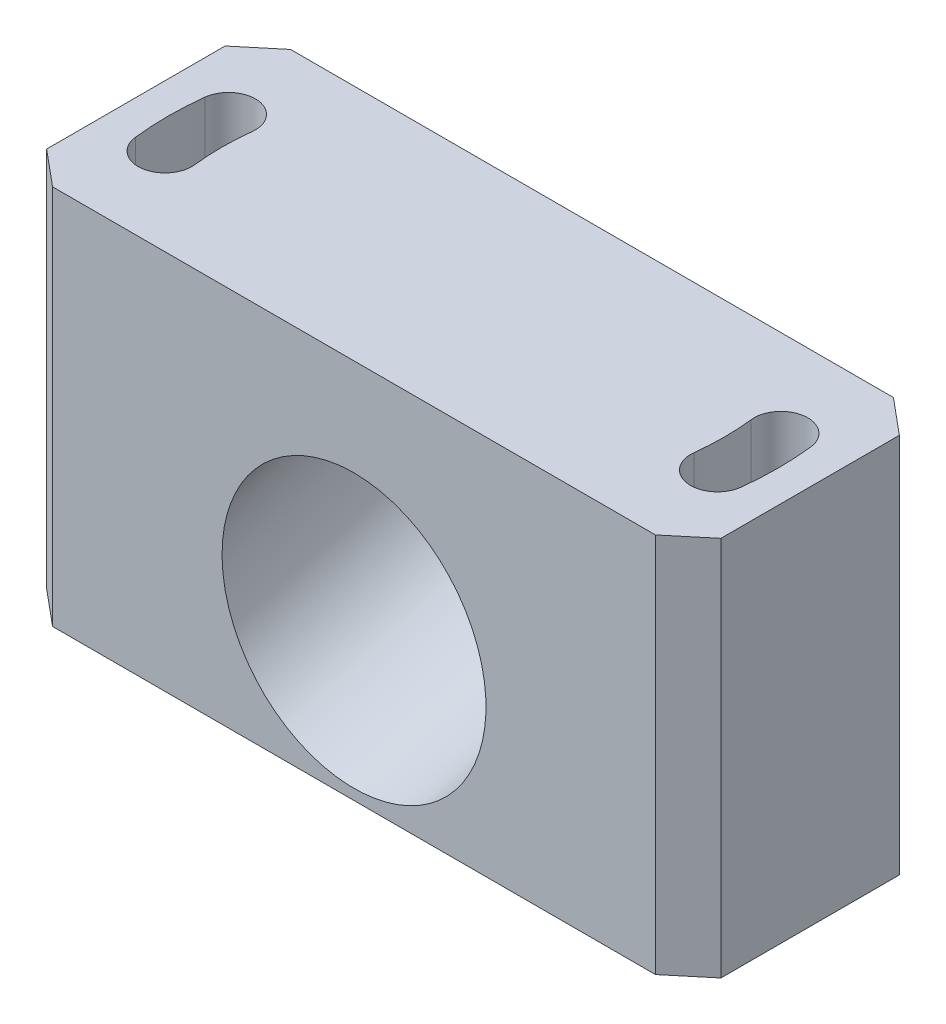
ISO-10303-21;
HEADER;
FILE_DESCRIPTION(('STEP AP214'),'2;1');
FILE_NAME('part.step','',(''),(''),'','','');
FILE_SCHEMA(('AUTOMOTIVE_DESIGN { 1 0 10303 214 1 1 1 1 }'));
ENDSEC;
DATA;
#1=APPLICATION_CONTEXT('core data for automotive mechanical design processes');
#2=APPLICATION_PROTOCOL_DEFINITION('international standard','automotive_design',2000,#1);
#3=PRODUCT_CONTEXT('',#1,'mechanical');
#4=PRODUCT('Part','Part','',(#3));
#5=PRODUCT_RELATED_PRODUCT_CATEGORY('part','',(#4));
#6=PRODUCT_DEFINITION_FORMATION('','',#4);
#7=PRODUCT_DEFINITION_CONTEXT('part definition',#1,'design');
#8=PRODUCT_DEFINITION('design','',#6,#7);
#9=PRODUCT_DEFINITION_SHAPE('','',#8);
#10=(LENGTH_UNIT() NAMED_UNIT(*) SI_UNIT(.MILLI.,.METRE.));
#11=(NAMED_UNIT(*) PLANE_ANGLE_UNIT() SI_UNIT($,.RADIAN.));
#12=(NAMED_UNIT(*) SI_UNIT($,.STERADIAN.) SOLID_ANGLE_UNIT());
#13=UNCERTAINTY_MEASURE_WITH_UNIT(LENGTH_MEASURE(1.E-05),#10,'distance_accuracy_value','');
#14=(GEOMETRIC_REPRESENTATION_CONTEXT(3) GLOBAL_UNCERTAINTY_ASSIGNED_CONTEXT((#13)) GLOBAL_UNIT_ASSIGNED_CONTEXT((#10,
#11,#12)) REPRESENTATION_CONTEXT('',''));
#15=CARTESIAN_POINT('',(0.,0.,0.));
#16=DIRECTION('',(0.,0.,1.));
#17=DIRECTION('',(1.,0.,0.));
#18=AXIS2_PLACEMENT_3D('',#15,#16,#17);
#19=CARTESIAN_POINT('',(0.,0.,15.));
#20=DIRECTION('',(0.,0.,-1.));
#21=DIRECTION('',(-1.,0.,0.));
#22=AXIS2_PLACEMENT_3D('',#19,#20,#21);
#23=PLANE('',#22);
#24=CARTESIAN_POINT('',(0.,-1.94868552564668,15.));
#25=DIRECTION('',(0.,0.,-1.));
#26=DIRECTION('',(0.,1.,0.));
#27=AXIS2_PLACEMENT_3D('',#24,#25,#26);
#28=ELLIPSE('',#27,17.2238898134826,16.637);
#29=CARTESIAN_POINT('',(0.,15.2752042878359,15.));
#30=VERTEX_POINT('',#29);
#31=EDGE_CURVE('E214',#30,#30,#28,.T.);
#32=ORIENTED_EDGE('',*,*,#31,.T.);
#33=EDGE_LOOP('',(#32));
#34=FACE_BOUND('',#33,.T.);
#35=DIRECTION('',(-1.,0.,0.));
#36=VECTOR('',#35,1.);
#37=CARTESIAN_POINT('',(0.,-20.5,15.));
#38=LINE('',#37,#36);
#39=CARTESIAN_POINT('',(38.,-20.5,15.));
#40=VERTEX_POINT('',#39);
#41=CARTESIAN_POINT('',(-38.,-20.5,15.));
#42=VERTEX_POINT('',#41);
#43=EDGE_CURVE('E327',#40,#42,#38,.T.);
#44=ORIENTED_EDGE('',*,*,#43,.F.);
#45=DIRECTION('',(0.,1.,0.));
#46=VECTOR('',#45,1.);
#47=CARTESIAN_POINT('',(38.,-27.5,15.));
#48=LINE('',#47,#46);
#49=CARTESIAN_POINT('',(38.,27.5,15.));
#50=VERTEX_POINT('',#49);
#51=EDGE_CURVE('E166',#40,#50,#48,.T.);
#52=ORIENTED_EDGE('',*,*,#51,.T.);
#53=DIRECTION('',(-1.,0.,0.));
#54=VECTOR('',#53,1.);
#55=CARTESIAN_POINT('',(-50.,27.5,15.));
#56=LINE('',#55,#54);
#57=CARTESIAN_POINT('',(-38.,27.5,15.));
#58=VERTEX_POINT('',#57);
#59=EDGE_CURVE('E48',#50,#58,#56,.T.);
#60=ORIENTED_EDGE('',*,*,#59,.T.);
#61=DIRECTION('',(0.,1.,0.));
#62=VECTOR('',#61,1.);
#63=CARTESIAN_POINT('',(-38.,-27.5,15.));
#64=LINE('',#63,#62);
#65=EDGE_CURVE('E193',#42,#58,#64,.T.);
#66=ORIENTED_EDGE('',*,*,#65,.F.);
#67=EDGE_LOOP('',(#44,#52,#60,#66));
#68=FACE_BOUND('',#67,.T.);
#69=ADVANCED_FACE('F39',(#34,#68),#23,.F.);
#70=CARTESIAN_POINT('',(0.,0.,-15.));
#71=DIRECTION('',(0.,0.,-1.));
#72=DIRECTION('',(-1.,0.,0.));
#73=AXIS2_PLACEMENT_3D('',#70,#71,#72);
#74=PLANE('',#73);
#75=CARTESIAN_POINT('',(0.,6.08979024728702,-15.));
#76=DIRECTION('',(0.,0.,-1.));
#77=DIRECTION('',(0.,1.,0.));
#78=AXIS2_PLACEMENT_3D('',#75,#76,#77);
#79=ELLIPSE('',#78,17.2238898134826,16.637);
#80=CARTESIAN_POINT('',(0.,23.3136800607696,-15.));
#81=VERTEX_POINT('',#80);
#82=EDGE_CURVE('E213',#81,#81,#79,.T.);
#83=ORIENTED_EDGE('',*,*,#82,.F.);
#84=EDGE_LOOP('',(#83));
#85=FACE_BOUND('',#84,.T.);
#86=DIRECTION('',(0.,1.,0.));
#87=VECTOR('',#86,1.);
#88=CARTESIAN_POINT('',(38.,-27.5,-15.));
#89=LINE('',#88,#87);
#90=CARTESIAN_POINT('',(38.,-20.5,-15.));
#91=VERTEX_POINT('',#90);
#92=CARTESIAN_POINT('',(38.,27.5,-15.));
#93=VERTEX_POINT('',#92);
#94=EDGE_CURVE('E210',#91,#93,#89,.T.);
#95=ORIENTED_EDGE('',*,*,#94,.F.);
#96=DIRECTION('',(-1.,0.,0.));
#97=VECTOR('',#96,1.);
#98=CARTESIAN_POINT('',(0.,-20.5,-15.));
#99=LINE('',#98,#97);
#100=CARTESIAN_POINT('',(-38.,-20.5,-15.));
#101=VERTEX_POINT('',#100);
#102=EDGE_CURVE('E294',#91,#101,#99,.T.);
#103=ORIENTED_EDGE('',*,*,#102,.T.);
#104=DIRECTION('',(0.,1.,0.));
#105=VECTOR('',#104,1.);
#106=CARTESIAN_POINT('',(-38.,-27.5,-15.));
#107=LINE('',#106,#105);
#108=CARTESIAN_POINT('',(-38.,27.5,-15.));
#109=VERTEX_POINT('',#108);
#110=EDGE_CURVE('E200',#101,#109,#107,.T.);
#111=ORIENTED_EDGE('',*,*,#110,.T.);
#112=DIRECTION('',(-1.,0.,0.));
#113=VECTOR('',#112,1.);
#114=CARTESIAN_POINT('',(-50.,27.5,-15.));
#115=LINE('',#114,#113);
#116=EDGE_CURVE('E240',#93,#109,#115,.T.);
#117=ORIENTED_EDGE('',*,*,#116,.F.);
#118=EDGE_LOOP('',(#95,#103,#111,#117));
#119=FACE_BOUND('',#118,.T.);
#120=ADVANCED_FACE('F287',(#85,#119),#74,.T.);
#121=CARTESIAN_POINT('',(34.8210065908497,-27.5,4.));
#122=DIRECTION('',(0.,1.,0.));
#123=DIRECTION('',(0.,0.,1.));
#124=AXIS2_PLACEMENT_3D('',#121,#122,#123);
#125=CYLINDRICAL_SURFACE('',#124,3.39);
#126=CARTESIAN_POINT('',(34.8210065908497,-20.5,4.));
#127=DIRECTION('',(0.,-1.,0.));
#128=DIRECTION('',(0.,0.,-1.));
#129=AXIS2_PLACEMENT_3D('',#126,#127,#128);
#130=CIRCLE('',#129,3.39);
#131=CARTESIAN_POINT('',(31.4531545981827,-20.5,3.61312410841655));
#132=VERTEX_POINT('',#131);
#133=CARTESIAN_POINT('',(38.1888585835168,-20.5,4.38687589158345));
#134=VERTEX_POINT('',#133);
#135=EDGE_CURVE('E55',#132,#134,#130,.F.);
#136=ORIENTED_EDGE('',*,*,#135,.F.);
#137=DIRECTION('',(0.,1.,0.));
#138=VECTOR('',#137,1.);
#139=CARTESIAN_POINT('',(31.4531545981827,-27.5,3.61312410841655));
#140=LINE('',#139,#138);
#141=CARTESIAN_POINT('',(31.4531545981827,27.5,3.61312410841655));
#142=VERTEX_POINT('',#141);
#143=EDGE_CURVE('E224',#132,#142,#140,.T.);
#144=ORIENTED_EDGE('',*,*,#143,.T.);
#145=CARTESIAN_POINT('',(34.8210065908497,27.5,4.));
#146=DIRECTION('',(0.,1.,0.));
#147=DIRECTION('',(0.,0.,1.));
#148=AXIS2_PLACEMENT_3D('',#145,#146,#147);
#149=CIRCLE('',#148,3.39);
#150=CARTESIAN_POINT('',(38.1888585835168,27.5,4.38687589158345));
#151=VERTEX_POINT('',#150);
#152=EDGE_CURVE('E218',#142,#151,#149,.T.);
#153=ORIENTED_EDGE('',*,*,#152,.T.);
#154=DIRECTION('',(0.,1.,0.));
#155=VECTOR('',#154,1.);
#156=CARTESIAN_POINT('',(38.1888585835168,-27.5,4.38687589158345));
#157=LINE('',#156,#155);
#158=EDGE_CURVE('E264',#134,#151,#157,.T.);
#159=ORIENTED_EDGE('',*,*,#158,.F.);
#160=EDGE_LOOP('',(#136,#144,#153,#159));
#161=FACE_BOUND('',#160,.T.);
#162=ADVANCED_FACE('F290',(#161),#125,.F.);
#163=CARTESIAN_POINT('',(-4.9960036108132E-13,-27.5,0.));
#164=DIRECTION('',(0.,1.,0.));
#165=DIRECTION('',(0.,0.,1.));
#166=AXIS2_PLACEMENT_3D('',#163,#164,#165);
#167=CYLINDRICAL_SURFACE('',#166,31.6600000000005);
#168=CARTESIAN_POINT('',(-4.9960036108132E-13,-20.5,0.));
#169=DIRECTION('',(0.,-1.,0.));
#170=DIRECTION('',(0.,0.,-1.));
#171=AXIS2_PLACEMENT_3D('',#168,#169,#170);
#172=CIRCLE('',#171,31.6600000000005);
#173=CARTESIAN_POINT('',(31.4531545981827,-20.5,-3.61312410841655));
#174=VERTEX_POINT('',#173);
#175=EDGE_CURVE('E304',#174,#132,#172,.T.);
#176=ORIENTED_EDGE('',*,*,#175,.F.);
#177=DIRECTION('',(0.,1.,0.));
#178=VECTOR('',#177,1.);
#179=CARTESIAN_POINT('',(31.4531545981827,-27.5,-3.61312410841655));
#180=LINE('',#179,#178);
#181=CARTESIAN_POINT('',(31.4531545981827,27.5,-3.61312410841655));
#182=VERTEX_POINT('',#181);
#183=EDGE_CURVE('E267',#174,#182,#180,.T.);
#184=ORIENTED_EDGE('',*,*,#183,.T.);
#185=CARTESIAN_POINT('',(-4.9960036108132E-13,27.5,0.));
#186=DIRECTION('',(0.,-1.,0.));
#187=DIRECTION('',(0.,0.,1.));
#188=AXIS2_PLACEMENT_3D('',#185,#186,#187);
#189=CIRCLE('',#188,31.6600000000005);
#190=EDGE_CURVE('E260',#182,#142,#189,.T.);
#191=ORIENTED_EDGE('',*,*,#190,.T.);
#192=ORIENTED_EDGE('',*,*,#143,.F.);
#193=EDGE_LOOP('',(#176,#184,#191,#192));
#194=FACE_BOUND('',#193,.T.);
#195=ADVANCED_FACE('F362',(#194),#167,.T.);
#196=CARTESIAN_POINT('',(34.8210065908497,-27.5,-4.));
#197=DIRECTION('',(0.,1.,0.));
#198=DIRECTION('',(0.,0.,1.));
#199=AXIS2_PLACEMENT_3D('',#196,#197,#198);
#200=CYLINDRICAL_SURFACE('',#199,3.39);
#201=CARTESIAN_POINT('',(34.8210065908497,-20.5,-4.));
#202=DIRECTION('',(0.,-1.,0.));
#203=DIRECTION('',(0.,0.,-1.));
#204=AXIS2_PLACEMENT_3D('',#201,#202,#203);
#205=CIRCLE('',#204,3.39);
#206=CARTESIAN_POINT('',(38.1888585835168,-20.5,-4.38687589158345));
#207=VERTEX_POINT('',#206);
#208=EDGE_CURVE('E307',#207,#174,#205,.F.);
#209=ORIENTED_EDGE('',*,*,#208,.F.);
#210=DIRECTION('',(0.,1.,0.));
#211=VECTOR('',#210,1.);
#212=CARTESIAN_POINT('',(38.1888585835168,-27.5,-4.38687589158345));
#213=LINE('',#212,#211);
#214=CARTESIAN_POINT('',(38.1888585835168,27.5,-4.38687589158345));
#215=VERTEX_POINT('',#214);
#216=EDGE_CURVE('E270',#207,#215,#213,.T.);
#217=ORIENTED_EDGE('',*,*,#216,.T.);
#218=CARTESIAN_POINT('',(34.8210065908497,27.5,-4.));
#219=DIRECTION('',(0.,1.,0.));
#220=DIRECTION('',(0.,0.,1.));
#221=AXIS2_PLACEMENT_3D('',#218,#219,#220);
#222=CIRCLE('',#221,3.39);
#223=EDGE_CURVE('E256',#215,#182,#222,.T.);
#224=ORIENTED_EDGE('',*,*,#223,.T.);
#225=ORIENTED_EDGE('',*,*,#183,.F.);
#226=EDGE_LOOP('',(#209,#217,#224,#225));
#227=FACE_BOUND('',#226,.T.);
#228=ADVANCED_FACE('F363',(#227),#200,.F.);
#229=CARTESIAN_POINT('',(-4.9960036108132E-13,-27.5,0.));
#230=DIRECTION('',(0.,1.,0.));
#231=DIRECTION('',(0.,0.,1.));
#232=AXIS2_PLACEMENT_3D('',#229,#230,#231);
#233=CYLINDRICAL_SURFACE('',#232,38.4400000000005);
#234=CARTESIAN_POINT('',(-4.9960036108132E-13,-20.5,0.));
#235=DIRECTION('',(0.,-1.,0.));
#236=DIRECTION('',(0.,0.,-1.));
#237=AXIS2_PLACEMENT_3D('',#234,#235,#236);
#238=CIRCLE('',#237,38.4400000000005);
#239=EDGE_CURVE('E352',#134,#207,#238,.F.);
#240=ORIENTED_EDGE('',*,*,#239,.F.);
#241=ORIENTED_EDGE('',*,*,#158,.T.);
#242=CARTESIAN_POINT('',(-4.9960036108132E-13,27.5,0.));
#243=DIRECTION('',(0.,1.,0.));
#244=DIRECTION('',(0.,0.,1.));
#245=AXIS2_PLACEMENT_3D('',#242,#243,#244);
#246=CIRCLE('',#245,38.4400000000005);
#247=EDGE_CURVE('E252',#151,#215,#246,.T.);
#248=ORIENTED_EDGE('',*,*,#247,.T.);
#249=ORIENTED_EDGE('',*,*,#216,.F.);
#250=EDGE_LOOP('',(#240,#241,#248,#249));
#251=FACE_BOUND('',#250,.T.);
#252=ADVANCED_FACE('F372',(#251),#233,.F.);
#253=CARTESIAN_POINT('',(-34.8210065908497,-27.5,-4.));
#254=DIRECTION('',(0.,1.,0.));
#255=DIRECTION('',(0.,0.,1.));
#256=AXIS2_PLACEMENT_3D('',#253,#254,#255);
#257=CYLINDRICAL_SURFACE('',#256,3.39000000000001);
#258=CARTESIAN_POINT('',(-34.8210065908497,-20.5,-4.));
#259=DIRECTION('',(0.,-1.,0.));
#260=DIRECTION('',(0.,0.,-1.));
#261=AXIS2_PLACEMENT_3D('',#258,#259,#260);
#262=CIRCLE('',#261,3.39000000000001);
#263=CARTESIAN_POINT('',(-31.4531545981827,-20.5,-3.61312410841657));
#264=VERTEX_POINT('',#263);
#265=CARTESIAN_POINT('',(-38.1888585835169,-20.5,-4.38687589158348));
#266=VERTEX_POINT('',#265);
#267=EDGE_CURVE('E63',#264,#266,#262,.F.);
#268=ORIENTED_EDGE('',*,*,#267,.F.);
#269=DIRECTION('',(0.,1.,0.));
#270=VECTOR('',#269,1.);
#271=CARTESIAN_POINT('',(-31.4531545981827,-27.5,-3.61312410841657));
#272=LINE('',#271,#270);
#273=CARTESIAN_POINT('',(-31.4531545981827,27.5,-3.61312410841657));
#274=VERTEX_POINT('',#273);
#275=EDGE_CURVE('E237',#264,#274,#272,.T.);
#276=ORIENTED_EDGE('',*,*,#275,.T.);
#277=CARTESIAN_POINT('',(-34.8210065908497,27.5,-4.));
#278=DIRECTION('',(0.,1.,0.));
#279=DIRECTION('',(0.,0.,1.));
#280=AXIS2_PLACEMENT_3D('',#277,#278,#279);
#281=CIRCLE('',#280,3.39000000000001);
#282=CARTESIAN_POINT('',(-38.1888585835169,27.5,-4.38687589158348));
#283=VERTEX_POINT('',#282);
#284=EDGE_CURVE('E219',#274,#283,#281,.T.);
#285=ORIENTED_EDGE('',*,*,#284,.T.);
#286=DIRECTION('',(0.,1.,0.));
#287=VECTOR('',#286,1.);
#288=CARTESIAN_POINT('',(-38.1888585835169,-27.5,-4.38687589158348));
#289=LINE('',#288,#287);
#290=EDGE_CURVE('E236',#266,#283,#289,.T.);
#291=ORIENTED_EDGE('',*,*,#290,.F.);
#292=EDGE_LOOP('',(#268,#276,#285,#291));
#293=FACE_BOUND('',#292,.T.);
#294=ADVANCED_FACE('F374',(#293),#257,.F.);
#295=CARTESIAN_POINT('',(0.,-27.5,0.));
#296=DIRECTION('',(0.,1.,0.));
#297=DIRECTION('',(0.,0.,1.));
#298=AXIS2_PLACEMENT_3D('',#295,#296,#297);
#299=CYLINDRICAL_SURFACE('',#298,31.6600000000002);
#300=CARTESIAN_POINT('',(0.,-20.5,0.));
#301=DIRECTION('',(0.,-1.,0.));
#302=DIRECTION('',(0.,0.,-1.));
#303=AXIS2_PLACEMENT_3D('',#300,#301,#302);
#304=CIRCLE('',#303,31.6600000000002);
#305=CARTESIAN_POINT('',(-31.4531545981826,-20.5,3.61312410841655));
#306=VERTEX_POINT('',#305);
#307=EDGE_CURVE('E347',#306,#264,#304,.T.);
#308=ORIENTED_EDGE('',*,*,#307,.F.);
#309=DIRECTION('',(0.,1.,0.));
#310=VECTOR('',#309,1.);
#311=CARTESIAN_POINT('',(-31.4531545981826,-27.5,3.61312410841655));
#312=LINE('',#311,#310);
#313=CARTESIAN_POINT('',(-31.4531545981826,27.5,3.61312410841655));
#314=VERTEX_POINT('',#313);
#315=EDGE_CURVE('E241',#306,#314,#312,.T.);
#316=ORIENTED_EDGE('',*,*,#315,.T.);
#317=CARTESIAN_POINT('',(0.,27.5,0.));
#318=DIRECTION('',(0.,-1.,0.));
#319=DIRECTION('',(0.,0.,1.));
#320=AXIS2_PLACEMENT_3D('',#317,#318,#319);
#321=CIRCLE('',#320,31.6600000000002);
#322=EDGE_CURVE('E232',#314,#274,#321,.T.);
#323=ORIENTED_EDGE('',*,*,#322,.T.);
#324=ORIENTED_EDGE('',*,*,#275,.F.);
#325=EDGE_LOOP('',(#308,#316,#323,#324));
#326=FACE_BOUND('',#325,.T.);
#327=ADVANCED_FACE('F380',(#326),#299,.T.);
#328=CARTESIAN_POINT('',(-34.8210065908497,-27.5,4.));
#329=DIRECTION('',(0.,1.,0.));
#330=DIRECTION('',(0.,0.,1.));
#331=AXIS2_PLACEMENT_3D('',#328,#329,#330);
#332=CYLINDRICAL_SURFACE('',#331,3.39000000000001);
#333=CARTESIAN_POINT('',(-34.8210065908497,-20.5,4.));
#334=DIRECTION('',(0.,-1.,0.));
#335=DIRECTION('',(0.,0.,-1.));
#336=AXIS2_PLACEMENT_3D('',#333,#334,#335);
#337=CIRCLE('',#336,3.39000000000001);
#338=CARTESIAN_POINT('',(-38.1888585835169,-20.5,4.38687589158347));
#339=VERTEX_POINT('',#338);
#340=EDGE_CURVE('E344',#339,#306,#337,.F.);
#341=ORIENTED_EDGE('',*,*,#340,.F.);
#342=DIRECTION('',(0.,1.,0.));
#343=VECTOR('',#342,1.);
#344=CARTESIAN_POINT('',(-38.1888585835169,-27.5,4.38687589158347));
#345=LINE('',#344,#343);
#346=CARTESIAN_POINT('',(-38.1888585835169,27.5,4.38687589158347));
#347=VERTEX_POINT('',#346);
#348=EDGE_CURVE('E244',#339,#347,#345,.T.);
#349=ORIENTED_EDGE('',*,*,#348,.T.);
#350=CARTESIAN_POINT('',(-34.8210065908497,27.5,4.));
#351=DIRECTION('',(0.,1.,0.));
#352=DIRECTION('',(0.,0.,1.));
#353=AXIS2_PLACEMENT_3D('',#350,#351,#352);
#354=CIRCLE('',#353,3.39000000000001);
#355=EDGE_CURVE('E228',#347,#314,#354,.T.);
#356=ORIENTED_EDGE('',*,*,#355,.T.);
#357=ORIENTED_EDGE('',*,*,#315,.F.);
#358=EDGE_LOOP('',(#341,#349,#356,#357));
#359=FACE_BOUND('',#358,.T.);
#360=ADVANCED_FACE('F401',(#359),#332,.F.);
#361=CARTESIAN_POINT('',(0.,-27.5,0.));
#362=DIRECTION('',(0.,1.,0.));
#363=DIRECTION('',(0.,0.,1.));
#364=AXIS2_PLACEMENT_3D('',#361,#362,#363);
#365=CYLINDRICAL_SURFACE('',#364,38.4400000000002);
#366=CARTESIAN_POINT('',(0.,-20.5,0.));
#367=DIRECTION('',(0.,-1.,0.));
#368=DIRECTION('',(0.,0.,-1.));
#369=AXIS2_PLACEMENT_3D('',#366,#367,#368);
#370=CIRCLE('',#369,38.4400000000002);
#371=EDGE_CURVE('E341',#266,#339,#370,.F.);
#372=ORIENTED_EDGE('',*,*,#371,.F.);
#373=ORIENTED_EDGE('',*,*,#290,.T.);
#374=CARTESIAN_POINT('',(0.,27.5,0.));
#375=DIRECTION('',(0.,1.,0.));
#376=DIRECTION('',(0.,0.,1.));
#377=AXIS2_PLACEMENT_3D('',#374,#375,#376);
#378=CIRCLE('',#377,38.4400000000002);
#379=EDGE_CURVE('E223',#283,#347,#378,.T.);
#380=ORIENTED_EDGE('',*,*,#379,.T.);
#381=ORIENTED_EDGE('',*,*,#348,.F.);
#382=EDGE_LOOP('',(#372,#373,#380,#381));
#383=FACE_BOUND('',#382,.T.);
#384=ADVANCED_FACE('F398',(#383),#365,.F.);
#385=CARTESIAN_POINT('',(22.9508196721312,-27.5,-27.5409836065574));
#386=DIRECTION('',(0.64018439966448,0.,-0.768221279597376));
#387=DIRECTION('',(-0.768221279597376,0.,-0.64018439966448));
#388=AXIS2_PLACEMENT_3D('',#385,#386,#387);
#389=PLANE('',#388);
#390=DIRECTION('',(0.,1.,0.));
#391=VECTOR('',#390,1.);
#392=CARTESIAN_POINT('',(42.5,-27.5,-11.25));
#393=LINE('',#392,#391);
#394=CARTESIAN_POINT('',(42.5,-20.5,-11.25));
#395=VERTEX_POINT('',#394);
#396=CARTESIAN_POINT('',(42.5,27.5,-11.25));
#397=VERTEX_POINT('',#396);
#398=EDGE_CURVE('E175',#395,#397,#393,.T.);
#399=ORIENTED_EDGE('',*,*,#398,.F.);
#400=DIRECTION('',(-0.768221279597376,0.,-0.64018439966448));
#401=VECTOR('',#400,1.);
#402=CARTESIAN_POINT('',(22.9508196721312,-20.5,-27.5409836065574));
#403=LINE('',#402,#401);
#404=EDGE_CURVE('E156',#395,#91,#403,.T.);
#405=ORIENTED_EDGE('',*,*,#404,.T.);
#406=ORIENTED_EDGE('',*,*,#94,.T.);
#407=DIRECTION('',(-0.768221279597376,0.,-0.64018439966448));
#408=VECTOR('',#407,1.);
#409=CARTESIAN_POINT('',(22.9508196721312,27.5,-27.5409836065574));
#410=LINE('',#409,#408);
#411=EDGE_CURVE('E192',#397,#93,#410,.T.);
#412=ORIENTED_EDGE('',*,*,#411,.F.);
#413=EDGE_LOOP('',(#399,#405,#406,#412));
#414=FACE_BOUND('',#413,.T.);
#415=ADVANCED_FACE('F298',(#414),#389,.T.);
#416=CARTESIAN_POINT('',(-50.,-27.5,-5.));
#417=DIRECTION('',(0.64018439966448,0.,0.768221279597376));
#418=DIRECTION('',(0.768221279597376,0.,-0.64018439966448));
#419=AXIS2_PLACEMENT_3D('',#416,#417,#418);
#420=PLANE('',#419);
#421=DIRECTION('',(0.768221279597376,0.,-0.64018439966448));
#422=VECTOR('',#421,1.);
#423=CARTESIAN_POINT('',(-50.,-20.5,-5.));
#424=LINE('',#423,#422);
#425=CARTESIAN_POINT('',(-42.5,-20.5,-11.25));
#426=VERTEX_POINT('',#425);
#427=EDGE_CURVE('E332',#426,#101,#424,.T.);
#428=ORIENTED_EDGE('',*,*,#427,.F.);
#429=DIRECTION('',(0.,1.,0.));
#430=VECTOR('',#429,1.);
#431=CARTESIAN_POINT('',(-42.5,-27.5,-11.25));
#432=LINE('',#431,#430);
#433=CARTESIAN_POINT('',(-42.5,27.5,-11.25));
#434=VERTEX_POINT('',#433);
#435=EDGE_CURVE('E203',#426,#434,#432,.T.);
#436=ORIENTED_EDGE('',*,*,#435,.T.);
#437=DIRECTION('',(0.768221279597376,0.,-0.64018439966448));
#438=VECTOR('',#437,1.);
#439=CARTESIAN_POINT('',(-50.,27.5,-5.));
#440=LINE('',#439,#438);
#441=EDGE_CURVE('E196',#434,#109,#440,.T.);
#442=ORIENTED_EDGE('',*,*,#441,.T.);
#443=ORIENTED_EDGE('',*,*,#110,.F.);
#444=EDGE_LOOP('',(#428,#436,#442,#443));
#445=FACE_BOUND('',#444,.T.);
#446=ADVANCED_FACE('F413',(#445),#420,.F.);
#447=CARTESIAN_POINT('',(22.9508196721312,-27.5,27.5409836065574));
#448=DIRECTION('',(0.64018439966448,0.,0.768221279597376));
#449=DIRECTION('',(0.768221279597376,0.,-0.64018439966448));
#450=AXIS2_PLACEMENT_3D('',#447,#448,#449);
#451=PLANE('',#450);
#452=ORIENTED_EDGE('',*,*,#51,.F.);
#453=DIRECTION('',(0.768221279597376,0.,-0.64018439966448));
#454=VECTOR('',#453,1.);
#455=CARTESIAN_POINT('',(22.9508196721312,-20.5,27.5409836065574));
#456=LINE('',#455,#454);
#457=CARTESIAN_POINT('',(42.5,-20.5,11.25));
#458=VERTEX_POINT('',#457);
#459=EDGE_CURVE('E153',#40,#458,#456,.T.);
#460=ORIENTED_EDGE('',*,*,#459,.T.);
#461=DIRECTION('',(0.,1.,0.));
#462=VECTOR('',#461,1.);
#463=CARTESIAN_POINT('',(42.5,-27.5,11.25));
#464=LINE('',#463,#462);
#465=CARTESIAN_POINT('',(42.5,27.5,11.25));
#466=VERTEX_POINT('',#465);
#467=EDGE_CURVE('E164',#458,#466,#464,.T.);
#468=ORIENTED_EDGE('',*,*,#467,.T.);
#469=DIRECTION('',(0.768221279597376,0.,-0.64018439966448));
#470=VECTOR('',#469,1.);
#471=CARTESIAN_POINT('',(22.9508196721312,27.5,27.5409836065574));
#472=LINE('',#471,#470);
#473=EDGE_CURVE('E188',#50,#466,#472,.T.);
#474=ORIENTED_EDGE('',*,*,#473,.F.);
#475=EDGE_LOOP('',(#452,#460,#468,#474));
#476=FACE_BOUND('',#475,.T.);
#477=ADVANCED_FACE('F162',(#476),#451,.T.);
#478=CARTESIAN_POINT('',(-38.,-27.5,15.));
#479=DIRECTION('',(0.64018439966448,0.,-0.768221279597376));
#480=DIRECTION('',(-0.768221279597376,0.,-0.64018439966448));
#481=AXIS2_PLACEMENT_3D('',#478,#479,#480);
#482=PLANE('',#481);
#483=DIRECTION('',(-0.768221279597376,0.,-0.64018439966448));
#484=VECTOR('',#483,1.);
#485=CARTESIAN_POINT('',(-38.,-20.5,15.));
#486=LINE('',#485,#484);
#487=CARTESIAN_POINT('',(-42.5,-20.5,11.25));
#488=VERTEX_POINT('',#487);
#489=EDGE_CURVE('E325',#42,#488,#486,.T.);
#490=ORIENTED_EDGE('',*,*,#489,.F.);
#491=ORIENTED_EDGE('',*,*,#65,.T.);
#492=DIRECTION('',(-0.768221279597376,0.,-0.64018439966448));
#493=VECTOR('',#492,1.);
#494=CARTESIAN_POINT('',(-38.,27.5,15.));
#495=LINE('',#494,#493);
#496=CARTESIAN_POINT('',(-42.5,27.5,11.25));
#497=VERTEX_POINT('',#496);
#498=EDGE_CURVE('E189',#58,#497,#495,.T.);
#499=ORIENTED_EDGE('',*,*,#498,.T.);
#500=DIRECTION('',(0.,1.,0.));
#501=VECTOR('',#500,1.);
#502=CARTESIAN_POINT('',(-42.5,-27.5,11.25));
#503=LINE('',#502,#501);
#504=EDGE_CURVE('E180',#488,#497,#503,.T.);
#505=ORIENTED_EDGE('',*,*,#504,.F.);
#506=EDGE_LOOP('',(#490,#491,#499,#505));
#507=FACE_BOUND('',#506,.T.);
#508=ADVANCED_FACE('F323',(#507),#482,.F.);
#509=CARTESIAN_POINT('',(-42.5,-27.5,-11.25));
#510=DIRECTION('',(1.,0.,0.));
#511=DIRECTION('',(0.,0.,-1.));
#512=AXIS2_PLACEMENT_3D('',#509,#510,#511);
#513=PLANE('',#512);
#514=DIRECTION('',(0.,0.,-1.));
#515=VECTOR('',#514,1.);
#516=CARTESIAN_POINT('',(-42.5,-20.5,-11.25));
#517=LINE('',#516,#515);
#518=EDGE_CURVE('E319',#488,#426,#517,.T.);
#519=ORIENTED_EDGE('',*,*,#518,.F.);
#520=ORIENTED_EDGE('',*,*,#504,.T.);
#521=DIRECTION('',(0.,0.,-1.));
#522=VECTOR('',#521,1.);
#523=CARTESIAN_POINT('',(-42.5,27.5,-11.25));
#524=LINE('',#523,#522);
#525=EDGE_CURVE('E174',#497,#434,#524,.T.);
#526=ORIENTED_EDGE('',*,*,#525,.T.);
#527=ORIENTED_EDGE('',*,*,#435,.F.);
#528=EDGE_LOOP('',(#519,#520,#526,#527));
#529=FACE_BOUND('',#528,.T.);
#530=ADVANCED_FACE('F317',(#529),#513,.F.);
#531=CARTESIAN_POINT('',(42.5,-27.5,-11.25));
#532=DIRECTION('',(-1.,0.,0.));
#533=DIRECTION('',(0.,0.,1.));
#534=AXIS2_PLACEMENT_3D('',#531,#532,#533);
#535=PLANE('',#534);
#536=DIRECTION('',(0.,0.,1.));
#537=VECTOR('',#536,1.);
#538=CARTESIAN_POINT('',(42.5,-20.5,-11.25));
#539=LINE('',#538,#537);
#540=EDGE_CURVE('E11',#395,#458,#539,.T.);
#541=ORIENTED_EDGE('',*,*,#540,.F.);
#542=ORIENTED_EDGE('',*,*,#398,.T.);
#543=DIRECTION('',(0.,0.,1.));
#544=VECTOR('',#543,1.);
#545=CARTESIAN_POINT('',(42.5,27.5,-11.25));
#546=LINE('',#545,#544);
#547=EDGE_CURVE('E171',#397,#466,#546,.T.);
#548=ORIENTED_EDGE('',*,*,#547,.T.);
#549=ORIENTED_EDGE('',*,*,#467,.F.);
#550=EDGE_LOOP('',(#541,#542,#548,#549));
#551=FACE_BOUND('',#550,.T.);
#552=ADVANCED_FACE('F169',(#551),#535,.F.);
#553=CARTESIAN_POINT('',(-50.,27.5,15.));
#554=DIRECTION('',(0.,-1.,0.));
#555=DIRECTION('',(0.,0.,-1.));
#556=AXIS2_PLACEMENT_3D('',#553,#554,#555);
#557=PLANE('',#556);
#558=ORIENTED_EDGE('',*,*,#379,.F.);
#559=ORIENTED_EDGE('',*,*,#284,.F.);
#560=ORIENTED_EDGE('',*,*,#322,.F.);
#561=ORIENTED_EDGE('',*,*,#355,.F.);
#562=EDGE_LOOP('',(#558,#559,#560,#561));
#563=FACE_BOUND('',#562,.T.);
#564=ORIENTED_EDGE('',*,*,#247,.F.);
#565=ORIENTED_EDGE('',*,*,#152,.F.);
#566=ORIENTED_EDGE('',*,*,#190,.F.);
#567=ORIENTED_EDGE('',*,*,#223,.F.);
#568=EDGE_LOOP('',(#564,#565,#566,#567));
#569=FACE_BOUND('',#568,.T.);
#570=ORIENTED_EDGE('',*,*,#441,.F.);
#571=ORIENTED_EDGE('',*,*,#525,.F.);
#572=ORIENTED_EDGE('',*,*,#498,.F.);
#573=ORIENTED_EDGE('',*,*,#59,.F.);
#574=ORIENTED_EDGE('',*,*,#473,.T.);
#575=ORIENTED_EDGE('',*,*,#547,.F.);
#576=ORIENTED_EDGE('',*,*,#411,.T.);
#577=ORIENTED_EDGE('',*,*,#116,.T.);
#578=EDGE_LOOP('',(#570,#571,#572,#573,#574,#575,#576,#577));
#579=FACE_BOUND('',#578,.T.);
#580=ADVANCED_FACE('F41',(#563,#569,#579),#557,.F.);
#581=CARTESIAN_POINT('',(0.,-3.66029904538585,21.3878286185883));
#582=DIRECTION('',(0.,0.258819045102521,-0.965925826289068));
#583=DIRECTION('',(0.,0.965925826289068,0.258819045102521));
#584=AXIS2_PLACEMENT_3D('',#581,#582,#583);
#585=CYLINDRICAL_SURFACE('',#584,16.637);
#586=ORIENTED_EDGE('',*,*,#82,.T.);
#587=EDGE_LOOP('',(#586));
#588=FACE_BOUND('',#587,.T.);
#589=ORIENTED_EDGE('',*,*,#31,.F.);
#590=EDGE_LOOP('',(#589));
#591=FACE_BOUND('',#590,.T.);
#592=ADVANCED_FACE('F284',(#588,#591),#585,.F.);
#593=CARTESIAN_POINT('',(0.,-20.5,0.));
#594=DIRECTION('',(0.,-1.,0.));
#595=DIRECTION('',(0.,0.,-1.));
#596=AXIS2_PLACEMENT_3D('',#593,#594,#595);
#597=PLANE('',#596);
#598=ORIENTED_EDGE('',*,*,#267,.T.);
#599=ORIENTED_EDGE('',*,*,#371,.T.);
#600=ORIENTED_EDGE('',*,*,#340,.T.);
#601=ORIENTED_EDGE('',*,*,#307,.T.);
#602=EDGE_LOOP('',(#598,#599,#600,#601));
#603=FACE_BOUND('',#602,.T.);
#604=ORIENTED_EDGE('',*,*,#518,.T.);
#605=ORIENTED_EDGE('',*,*,#427,.T.);
#606=ORIENTED_EDGE('',*,*,#102,.F.);
#607=ORIENTED_EDGE('',*,*,#404,.F.);
#608=ORIENTED_EDGE('',*,*,#540,.T.);
#609=ORIENTED_EDGE('',*,*,#459,.F.);
#610=ORIENTED_EDGE('',*,*,#43,.T.);
#611=ORIENTED_EDGE('',*,*,#489,.T.);
#612=EDGE_LOOP('',(#604,#605,#606,#607,#608,#609,#610,#611));
#613=FACE_BOUND('',#612,.T.);
#614=ORIENTED_EDGE('',*,*,#135,.T.);
#615=ORIENTED_EDGE('',*,*,#239,.T.);
#616=ORIENTED_EDGE('',*,*,#208,.T.);
#617=ORIENTED_EDGE('',*,*,#175,.T.);
#618=EDGE_LOOP('',(#614,#615,#616,#617));
#619=FACE_BOUND('',#618,.T.);
#620=ADVANCED_FACE('F152',(#603,#613,#619),#597,.T.);
#621=CLOSED_SHELL('',(#69,#120,#162,#195,#228,#252,#294,#327,#360,#384,#415,#446,#477,#508,#530,
#552,#580,#592,#620));
#622=MANIFOLD_SOLID_BREP('B2',#621);
#623=ADVANCED_BREP_SHAPE_REPRESENTATION('',(#18,#622),#14);
#624=SHAPE_DEFINITION_REPRESENTATION(#9,#623);
ENDSEC;
END-ISO-10303-21;
